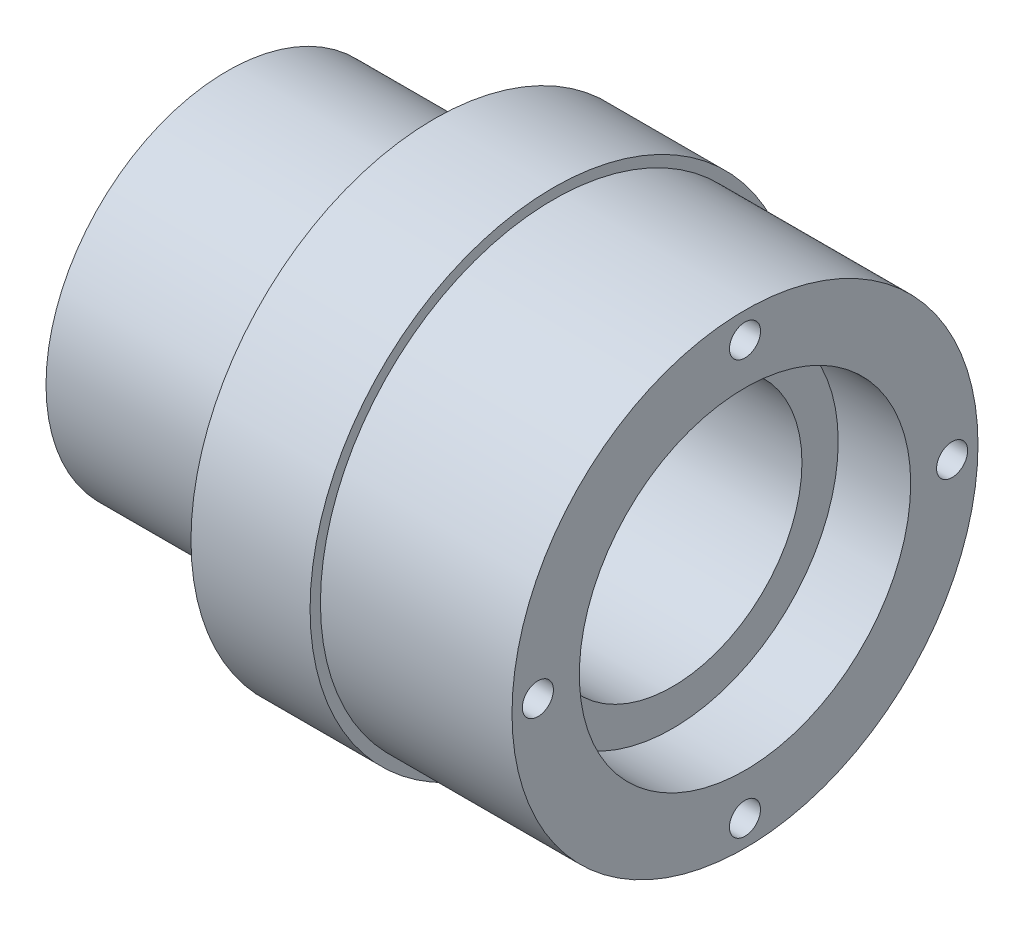
ISO-10303-21;
HEADER;
FILE_DESCRIPTION(('STEP AP214'),'2;1');
FILE_NAME('part.step','',(''),(''),'','','');
FILE_SCHEMA(('AUTOMOTIVE_DESIGN { 1 0 10303 214 1 1 1 1 }'));
ENDSEC;
DATA;
#1=APPLICATION_CONTEXT('core data for automotive mechanical design processes');
#2=APPLICATION_PROTOCOL_DEFINITION('international standard','automotive_design',2000,#1);
#3=PRODUCT_CONTEXT('',#1,'mechanical');
#4=PRODUCT('Part','Part','',(#3));
#5=PRODUCT_RELATED_PRODUCT_CATEGORY('part','',(#4));
#6=PRODUCT_DEFINITION_FORMATION('','',#4);
#7=PRODUCT_DEFINITION_CONTEXT('part definition',#1,'design');
#8=PRODUCT_DEFINITION('design','',#6,#7);
#9=PRODUCT_DEFINITION_SHAPE('','',#8);
#10=(LENGTH_UNIT() NAMED_UNIT(*) SI_UNIT(.MILLI.,.METRE.));
#11=(NAMED_UNIT(*) PLANE_ANGLE_UNIT() SI_UNIT($,.RADIAN.));
#12=(NAMED_UNIT(*) SI_UNIT($,.STERADIAN.) SOLID_ANGLE_UNIT());
#13=UNCERTAINTY_MEASURE_WITH_UNIT(LENGTH_MEASURE(1.E-05),#10,'distance_accuracy_value','');
#14=(GEOMETRIC_REPRESENTATION_CONTEXT(3) GLOBAL_UNCERTAINTY_ASSIGNED_CONTEXT((#13)) GLOBAL_UNIT_ASSIGNED_CONTEXT((#10,
#11,#12)) REPRESENTATION_CONTEXT('',''));
#15=CARTESIAN_POINT('',(0.,0.,0.));
#16=DIRECTION('',(0.,0.,1.));
#17=DIRECTION('',(1.,0.,0.));
#18=AXIS2_PLACEMENT_3D('',#15,#16,#17);
#19=CARTESIAN_POINT('',(15.,0.,0.));
#20=DIRECTION('',(-1.,0.,0.));
#21=DIRECTION('',(0.,0.,1.));
#22=AXIS2_PLACEMENT_3D('',#19,#20,#21);
#23=CYLINDRICAL_SURFACE('',#22,22.5);
#24=CARTESIAN_POINT('',(15.,0.,0.));
#25=DIRECTION('',(1.,0.,0.));
#26=DIRECTION('',(0.,0.,-1.));
#27=AXIS2_PLACEMENT_3D('',#24,#25,#26);
#28=CIRCLE('',#27,22.5);
#29=CARTESIAN_POINT('',(15.,0.,-22.5));
#30=VERTEX_POINT('',#29);
#31=EDGE_CURVE('E46',#30,#30,#28,.T.);
#32=ORIENTED_EDGE('',*,*,#31,.F.);
#33=EDGE_LOOP('',(#32));
#34=FACE_BOUND('',#33,.T.);
#35=CARTESIAN_POINT('',(-3.5,0.,0.));
#36=DIRECTION('',(-1.,0.,0.));
#37=DIRECTION('',(0.,0.,1.));
#38=AXIS2_PLACEMENT_3D('',#35,#36,#37);
#39=CIRCLE('',#38,22.5);
#40=CARTESIAN_POINT('',(-3.5,0.,22.5));
#41=VERTEX_POINT('',#40);
#42=EDGE_CURVE('E10',#41,#41,#39,.T.);
#43=ORIENTED_EDGE('',*,*,#42,.F.);
#44=EDGE_LOOP('',(#43));
#45=FACE_BOUND('',#44,.T.);
#46=ADVANCED_FACE('F36',(#34,#45),#23,.T.);
#47=CARTESIAN_POINT('',(15.,0.,0.));
#48=DIRECTION('',(-1.,0.,0.));
#49=DIRECTION('',(0.,0.,1.));
#50=AXIS2_PLACEMENT_3D('',#47,#48,#49);
#51=CYLINDRICAL_SURFACE('',#50,12.5);
#52=CARTESIAN_POINT('',(8.,0.,0.));
#53=DIRECTION('',(1.,0.,0.));
#54=DIRECTION('',(0.,0.,-1.));
#55=AXIS2_PLACEMENT_3D('',#52,#53,#54);
#56=CIRCLE('',#55,12.5);
#57=CARTESIAN_POINT('',(8.,0.,-12.5));
#58=VERTEX_POINT('',#57);
#59=EDGE_CURVE('E59',#58,#58,#56,.T.);
#60=ORIENTED_EDGE('',*,*,#59,.T.);
#61=EDGE_LOOP('',(#60));
#62=FACE_BOUND('',#61,.T.);
#63=CARTESIAN_POINT('',(-28.,0.,0.));
#64=DIRECTION('',(-1.,0.,0.));
#65=DIRECTION('',(0.,0.,1.));
#66=AXIS2_PLACEMENT_3D('',#63,#64,#65);
#67=CIRCLE('',#66,12.5);
#68=CARTESIAN_POINT('',(-28.,0.,12.5));
#69=VERTEX_POINT('',#68);
#70=EDGE_CURVE('E68',#69,#69,#67,.T.);
#71=ORIENTED_EDGE('',*,*,#70,.T.);
#72=EDGE_LOOP('',(#71));
#73=FACE_BOUND('',#72,.T.);
#74=ADVANCED_FACE('F140',(#62,#73),#51,.F.);
#75=CARTESIAN_POINT('',(-15.,0.,0.));
#76=DIRECTION('',(1.,0.,0.));
#77=DIRECTION('',(0.,0.,-1.));
#78=AXIS2_PLACEMENT_3D('',#75,#76,#77);
#79=PLANE('',#78);
#80=CARTESIAN_POINT('',(-15.,20.,0.));
#81=DIRECTION('',(-1.,0.,0.));
#82=DIRECTION('',(0.,0.,1.));
#83=AXIS2_PLACEMENT_3D('',#80,#81,#82);
#84=CIRCLE('',#83,1.5);
#85=CARTESIAN_POINT('',(-15.,20.,1.5));
#86=VERTEX_POINT('',#85);
#87=EDGE_CURVE('E117',#86,#86,#84,.T.);
#88=ORIENTED_EDGE('',*,*,#87,.F.);
#89=EDGE_LOOP('',(#88));
#90=FACE_BOUND('',#89,.T.);
#91=CARTESIAN_POINT('',(-15.,0.,19.9999999999998));
#92=DIRECTION('',(-1.,0.,0.));
#93=DIRECTION('',(0.,0.,1.));
#94=AXIS2_PLACEMENT_3D('',#91,#92,#93);
#95=CIRCLE('',#94,1.5);
#96=CARTESIAN_POINT('',(-15.,0.,21.4999999999998));
#97=VERTEX_POINT('',#96);
#98=EDGE_CURVE('E114',#97,#97,#95,.T.);
#99=ORIENTED_EDGE('',*,*,#98,.F.);
#100=EDGE_LOOP('',(#99));
#101=FACE_BOUND('',#100,.T.);
#102=CARTESIAN_POINT('',(-15.,-19.9999999999998,-1.97758476261356E-13));
#103=DIRECTION('',(-1.,0.,0.));
#104=DIRECTION('',(0.,0.,1.));
#105=AXIS2_PLACEMENT_3D('',#102,#103,#104);
#106=CIRCLE('',#105,1.5);
#107=CARTESIAN_POINT('',(-15.,-19.9999999999998,1.4999999999998));
#108=VERTEX_POINT('',#107);
#109=EDGE_CURVE('E108',#108,#108,#106,.T.);
#110=ORIENTED_EDGE('',*,*,#109,.F.);
#111=EDGE_LOOP('',(#110));
#112=FACE_BOUND('',#111,.T.);
#113=CARTESIAN_POINT('',(-15.,2.09488880330588E-13,-20.));
#114=DIRECTION('',(-1.,0.,0.));
#115=DIRECTION('',(0.,0.,1.));
#116=AXIS2_PLACEMENT_3D('',#113,#114,#115);
#117=CIRCLE('',#116,1.5);
#118=CARTESIAN_POINT('',(-15.,2.09488880330588E-13,-18.5));
#119=VERTEX_POINT('',#118);
#120=EDGE_CURVE('E101',#119,#119,#117,.T.);
#121=ORIENTED_EDGE('',*,*,#120,.F.);
#122=EDGE_LOOP('',(#121));
#123=FACE_BOUND('',#122,.T.);
#124=CARTESIAN_POINT('',(-15.,0.,0.));
#125=DIRECTION('',(1.,0.,0.));
#126=DIRECTION('',(0.,0.,-1.));
#127=AXIS2_PLACEMENT_3D('',#124,#125,#126);
#128=CIRCLE('',#127,17.5);
#129=CARTESIAN_POINT('',(-15.,0.,-17.5));
#130=VERTEX_POINT('',#129);
#131=EDGE_CURVE('E42',#130,#130,#128,.F.);
#132=ORIENTED_EDGE('',*,*,#131,.F.);
#133=EDGE_LOOP('',(#132));
#134=FACE_BOUND('',#133,.T.);
#135=CARTESIAN_POINT('',(-15.,0.,0.));
#136=DIRECTION('',(-1.,0.,0.));
#137=DIRECTION('',(0.,0.,1.));
#138=AXIS2_PLACEMENT_3D('',#135,#136,#137);
#139=CIRCLE('',#138,23.5);
#140=CARTESIAN_POINT('',(-15.,0.,23.5));
#141=VERTEX_POINT('',#140);
#142=EDGE_CURVE('E122',#141,#141,#139,.T.);
#143=ORIENTED_EDGE('',*,*,#142,.T.);
#144=EDGE_LOOP('',(#143));
#145=FACE_BOUND('',#144,.T.);
#146=ADVANCED_FACE('F147',(#90,#101,#112,#123,#134,#145),#79,.F.);
#147=CARTESIAN_POINT('',(15.,0.,0.));
#148=DIRECTION('',(1.,0.,0.));
#149=DIRECTION('',(0.,0.,-1.));
#150=AXIS2_PLACEMENT_3D('',#147,#148,#149);
#151=PLANE('',#150);
#152=CARTESIAN_POINT('',(15.,20.,0.));
#153=DIRECTION('',(1.,0.,0.));
#154=DIRECTION('',(0.,0.,-1.));
#155=AXIS2_PLACEMENT_3D('',#152,#153,#154);
#156=CIRCLE('',#155,1.5);
#157=CARTESIAN_POINT('',(15.,20.,-1.5));
#158=VERTEX_POINT('',#157);
#159=EDGE_CURVE('E93',#158,#158,#156,.T.);
#160=ORIENTED_EDGE('',*,*,#159,.F.);
#161=EDGE_LOOP('',(#160));
#162=FACE_BOUND('',#161,.T.);
#163=CARTESIAN_POINT('',(15.,0.,-20.0000000000003));
#164=DIRECTION('',(1.,0.,0.));
#165=DIRECTION('',(0.,0.,-1.));
#166=AXIS2_PLACEMENT_3D('',#163,#164,#165);
#167=CIRCLE('',#166,1.5);
#168=CARTESIAN_POINT('',(15.,0.,-21.5000000000003));
#169=VERTEX_POINT('',#168);
#170=EDGE_CURVE('E90',#169,#169,#167,.T.);
#171=ORIENTED_EDGE('',*,*,#170,.F.);
#172=EDGE_LOOP('',(#171));
#173=FACE_BOUND('',#172,.T.);
#174=CARTESIAN_POINT('',(15.,-20.,-5.30735490439912E-13));
#175=DIRECTION('',(1.,0.,0.));
#176=DIRECTION('',(0.,0.,-1.));
#177=AXIS2_PLACEMENT_3D('',#174,#175,#176);
#178=CIRCLE('',#177,1.5);
#179=CARTESIAN_POINT('',(15.,-20.,-1.50000000000053));
#180=VERTEX_POINT('',#179);
#181=EDGE_CURVE('E84',#180,#180,#178,.T.);
#182=ORIENTED_EDGE('',*,*,#181,.F.);
#183=EDGE_LOOP('',(#182));
#184=FACE_BOUND('',#183,.T.);
#185=CARTESIAN_POINT('',(15.,0.,19.9999999999997));
#186=DIRECTION('',(1.,0.,0.));
#187=DIRECTION('',(0.,0.,-1.));
#188=AXIS2_PLACEMENT_3D('',#185,#186,#187);
#189=CIRCLE('',#188,1.5);
#190=CARTESIAN_POINT('',(15.,0.,18.4999999999997));
#191=VERTEX_POINT('',#190);
#192=EDGE_CURVE('E77',#191,#191,#189,.T.);
#193=ORIENTED_EDGE('',*,*,#192,.F.);
#194=EDGE_LOOP('',(#193));
#195=FACE_BOUND('',#194,.T.);
#196=CARTESIAN_POINT('',(15.,0.,0.));
#197=DIRECTION('',(1.,0.,0.));
#198=DIRECTION('',(0.,0.,-1.));
#199=AXIS2_PLACEMENT_3D('',#196,#197,#198);
#200=CIRCLE('',#199,16.);
#201=CARTESIAN_POINT('',(15.,0.,-16.));
#202=VERTEX_POINT('',#201);
#203=EDGE_CURVE('E56',#202,#202,#200,.T.);
#204=ORIENTED_EDGE('',*,*,#203,.F.);
#205=EDGE_LOOP('',(#204));
#206=FACE_BOUND('',#205,.T.);
#207=ORIENTED_EDGE('',*,*,#31,.T.);
#208=EDGE_LOOP('',(#207));
#209=FACE_BOUND('',#208,.T.);
#210=ADVANCED_FACE('F153',(#162,#173,#184,#195,#206,#209),#151,.T.);
#211=CARTESIAN_POINT('',(-35.,0.,0.));
#212=DIRECTION('',(-1.,0.,0.));
#213=DIRECTION('',(0.,0.,1.));
#214=AXIS2_PLACEMENT_3D('',#211,#212,#213);
#215=PLANE('',#214);
#216=CARTESIAN_POINT('',(-35.,0.,0.));
#217=DIRECTION('',(-1.,0.,0.));
#218=DIRECTION('',(0.,0.,1.));
#219=AXIS2_PLACEMENT_3D('',#216,#217,#218);
#220=CIRCLE('',#219,16.);
#221=CARTESIAN_POINT('',(-35.,0.,16.));
#222=VERTEX_POINT('',#221);
#223=EDGE_CURVE('E65',#222,#222,#220,.T.);
#224=ORIENTED_EDGE('',*,*,#223,.F.);
#225=EDGE_LOOP('',(#224));
#226=FACE_BOUND('',#225,.T.);
#227=CARTESIAN_POINT('',(-35.,0.,0.));
#228=DIRECTION('',(-1.,0.,0.));
#229=DIRECTION('',(0.,0.,1.));
#230=AXIS2_PLACEMENT_3D('',#227,#228,#229);
#231=CIRCLE('',#230,17.5);
#232=CARTESIAN_POINT('',(-35.,0.,17.5));
#233=VERTEX_POINT('',#232);
#234=EDGE_CURVE('E50',#233,#233,#231,.T.);
#235=ORIENTED_EDGE('',*,*,#234,.T.);
#236=EDGE_LOOP('',(#235));
#237=FACE_BOUND('',#236,.T.);
#238=ADVANCED_FACE('F155',(#226,#237),#215,.T.);
#239=CARTESIAN_POINT('',(-35.,0.,0.));
#240=DIRECTION('',(1.,0.,0.));
#241=DIRECTION('',(0.,0.,-1.));
#242=AXIS2_PLACEMENT_3D('',#239,#240,#241);
#243=CYLINDRICAL_SURFACE('',#242,17.5);
#244=ORIENTED_EDGE('',*,*,#234,.F.);
#245=EDGE_LOOP('',(#244));
#246=FACE_BOUND('',#245,.T.);
#247=ORIENTED_EDGE('',*,*,#131,.T.);
#248=EDGE_LOOP('',(#247));
#249=FACE_BOUND('',#248,.T.);
#250=ADVANCED_FACE('F163',(#246,#249),#243,.T.);
#251=CARTESIAN_POINT('',(8.,0.,0.));
#252=DIRECTION('',(1.,0.,0.));
#253=DIRECTION('',(0.,0.,-1.));
#254=AXIS2_PLACEMENT_3D('',#251,#252,#253);
#255=CYLINDRICAL_SURFACE('',#254,16.);
#256=CARTESIAN_POINT('',(8.,0.,0.));
#257=DIRECTION('',(1.,0.,0.));
#258=DIRECTION('',(0.,0.,-1.));
#259=AXIS2_PLACEMENT_3D('',#256,#257,#258);
#260=CIRCLE('',#259,16.);
#261=CARTESIAN_POINT('',(8.,0.,-16.));
#262=VERTEX_POINT('',#261);
#263=EDGE_CURVE('E55',#262,#262,#260,.T.);
#264=ORIENTED_EDGE('',*,*,#263,.F.);
#265=EDGE_LOOP('',(#264));
#266=FACE_BOUND('',#265,.T.);
#267=ORIENTED_EDGE('',*,*,#203,.T.);
#268=EDGE_LOOP('',(#267));
#269=FACE_BOUND('',#268,.T.);
#270=ADVANCED_FACE('F171',(#266,#269),#255,.F.);
#271=CARTESIAN_POINT('',(8.,0.,0.));
#272=DIRECTION('',(1.,0.,0.));
#273=DIRECTION('',(0.,0.,-1.));
#274=AXIS2_PLACEMENT_3D('',#271,#272,#273);
#275=PLANE('',#274);
#276=ORIENTED_EDGE('',*,*,#59,.F.);
#277=EDGE_LOOP('',(#276));
#278=FACE_BOUND('',#277,.T.);
#279=ORIENTED_EDGE('',*,*,#263,.T.);
#280=EDGE_LOOP('',(#279));
#281=FACE_BOUND('',#280,.T.);
#282=ADVANCED_FACE('F176',(#278,#281),#275,.T.);
#283=CARTESIAN_POINT('',(-28.,0.,0.));
#284=DIRECTION('',(-1.,0.,0.));
#285=DIRECTION('',(0.,0.,1.));
#286=AXIS2_PLACEMENT_3D('',#283,#284,#285);
#287=CYLINDRICAL_SURFACE('',#286,16.);
#288=CARTESIAN_POINT('',(-28.,0.,0.));
#289=DIRECTION('',(-1.,0.,0.));
#290=DIRECTION('',(0.,0.,1.));
#291=AXIS2_PLACEMENT_3D('',#288,#289,#290);
#292=CIRCLE('',#291,16.);
#293=CARTESIAN_POINT('',(-28.,0.,16.));
#294=VERTEX_POINT('',#293);
#295=EDGE_CURVE('E64',#294,#294,#292,.T.);
#296=ORIENTED_EDGE('',*,*,#295,.F.);
#297=EDGE_LOOP('',(#296));
#298=FACE_BOUND('',#297,.T.);
#299=ORIENTED_EDGE('',*,*,#223,.T.);
#300=EDGE_LOOP('',(#299));
#301=FACE_BOUND('',#300,.T.);
#302=ADVANCED_FACE('F180',(#298,#301),#287,.F.);
#303=CARTESIAN_POINT('',(-28.,0.,0.));
#304=DIRECTION('',(-1.,0.,0.));
#305=DIRECTION('',(0.,0.,1.));
#306=AXIS2_PLACEMENT_3D('',#303,#304,#305);
#307=PLANE('',#306);
#308=ORIENTED_EDGE('',*,*,#70,.F.);
#309=EDGE_LOOP('',(#308));
#310=FACE_BOUND('',#309,.T.);
#311=ORIENTED_EDGE('',*,*,#295,.T.);
#312=EDGE_LOOP('',(#311));
#313=FACE_BOUND('',#312,.T.);
#314=ADVANCED_FACE('F184',(#310,#313),#307,.T.);
#315=CARTESIAN_POINT('',(10.,0.,19.9999999999997));
#316=DIRECTION('',(1.,0.,0.));
#317=DIRECTION('',(0.,0.,-1.));
#318=AXIS2_PLACEMENT_3D('',#315,#316,#317);
#319=CYLINDRICAL_SURFACE('',#318,1.5);
#320=CARTESIAN_POINT('',(10.,0.,19.9999999999997));
#321=DIRECTION('',(1.,0.,0.));
#322=DIRECTION('',(0.,0.,-1.));
#323=AXIS2_PLACEMENT_3D('',#320,#321,#322);
#324=CIRCLE('',#323,1.5);
#325=CARTESIAN_POINT('',(10.,0.,18.4999999999997));
#326=VERTEX_POINT('',#325);
#327=EDGE_CURVE('E74',#326,#326,#324,.T.);
#328=ORIENTED_EDGE('',*,*,#327,.F.);
#329=EDGE_LOOP('',(#328));
#330=FACE_BOUND('',#329,.T.);
#331=ORIENTED_EDGE('',*,*,#192,.T.);
#332=EDGE_LOOP('',(#331));
#333=FACE_BOUND('',#332,.T.);
#334=ADVANCED_FACE('F187',(#330,#333),#319,.F.);
#335=CARTESIAN_POINT('',(10.,0.,19.9999999999997));
#336=DIRECTION('',(1.,0.,0.));
#337=DIRECTION('',(0.,0.,-1.));
#338=AXIS2_PLACEMENT_3D('',#335,#336,#337);
#339=PLANE('',#338);
#340=ORIENTED_EDGE('',*,*,#327,.T.);
#341=EDGE_LOOP('',(#340));
#342=FACE_BOUND('',#341,.T.);
#343=ADVANCED_FACE('F189',(#342),#339,.T.);
#344=CARTESIAN_POINT('',(10.,-20.,-5.30735490439912E-13));
#345=DIRECTION('',(1.,0.,0.));
#346=DIRECTION('',(0.,0.,-1.));
#347=AXIS2_PLACEMENT_3D('',#344,#345,#346);
#348=CYLINDRICAL_SURFACE('',#347,1.5);
#349=CARTESIAN_POINT('',(10.,-20.,-5.30735490439912E-13));
#350=DIRECTION('',(1.,0.,0.));
#351=DIRECTION('',(0.,0.,-1.));
#352=AXIS2_PLACEMENT_3D('',#349,#350,#351);
#353=CIRCLE('',#352,1.5);
#354=CARTESIAN_POINT('',(10.,-20.,-1.50000000000053));
#355=VERTEX_POINT('',#354);
#356=EDGE_CURVE('E81',#355,#355,#353,.T.);
#357=ORIENTED_EDGE('',*,*,#356,.F.);
#358=EDGE_LOOP('',(#357));
#359=FACE_BOUND('',#358,.T.);
#360=ORIENTED_EDGE('',*,*,#181,.T.);
#361=EDGE_LOOP('',(#360));
#362=FACE_BOUND('',#361,.T.);
#363=ADVANCED_FACE('F192',(#359,#362),#348,.F.);
#364=CARTESIAN_POINT('',(10.,-20.,-5.30735490439912E-13));
#365=DIRECTION('',(1.,0.,0.));
#366=DIRECTION('',(0.,0.,-1.));
#367=AXIS2_PLACEMENT_3D('',#364,#365,#366);
#368=PLANE('',#367);
#369=ORIENTED_EDGE('',*,*,#356,.T.);
#370=EDGE_LOOP('',(#369));
#371=FACE_BOUND('',#370,.T.);
#372=ADVANCED_FACE('F196',(#371),#368,.T.);
#373=CARTESIAN_POINT('',(10.,0.,-20.0000000000003));
#374=DIRECTION('',(1.,0.,0.));
#375=DIRECTION('',(0.,0.,-1.));
#376=AXIS2_PLACEMENT_3D('',#373,#374,#375);
#377=CYLINDRICAL_SURFACE('',#376,1.5);
#378=CARTESIAN_POINT('',(10.,0.,-20.0000000000003));
#379=DIRECTION('',(1.,0.,0.));
#380=DIRECTION('',(0.,0.,-1.));
#381=AXIS2_PLACEMENT_3D('',#378,#379,#380);
#382=CIRCLE('',#381,1.5);
#383=CARTESIAN_POINT('',(10.,0.,-21.5000000000003));
#384=VERTEX_POINT('',#383);
#385=EDGE_CURVE('E87',#384,#384,#382,.T.);
#386=ORIENTED_EDGE('',*,*,#385,.F.);
#387=EDGE_LOOP('',(#386));
#388=FACE_BOUND('',#387,.T.);
#389=ORIENTED_EDGE('',*,*,#170,.T.);
#390=EDGE_LOOP('',(#389));
#391=FACE_BOUND('',#390,.T.);
#392=ADVANCED_FACE('F199',(#388,#391),#377,.F.);
#393=CARTESIAN_POINT('',(10.,0.,-20.0000000000003));
#394=DIRECTION('',(1.,0.,0.));
#395=DIRECTION('',(0.,0.,-1.));
#396=AXIS2_PLACEMENT_3D('',#393,#394,#395);
#397=PLANE('',#396);
#398=ORIENTED_EDGE('',*,*,#385,.T.);
#399=EDGE_LOOP('',(#398));
#400=FACE_BOUND('',#399,.T.);
#401=ADVANCED_FACE('F204',(#400),#397,.T.);
#402=CARTESIAN_POINT('',(10.,20.,0.));
#403=DIRECTION('',(1.,0.,0.));
#404=DIRECTION('',(0.,0.,-1.));
#405=AXIS2_PLACEMENT_3D('',#402,#403,#404);
#406=CYLINDRICAL_SURFACE('',#405,1.5);
#407=CARTESIAN_POINT('',(10.,20.,0.));
#408=DIRECTION('',(1.,0.,0.));
#409=DIRECTION('',(0.,0.,-1.));
#410=AXIS2_PLACEMENT_3D('',#407,#408,#409);
#411=CIRCLE('',#410,1.5);
#412=CARTESIAN_POINT('',(10.,20.,-1.5));
#413=VERTEX_POINT('',#412);
#414=EDGE_CURVE('E73',#413,#413,#411,.T.);
#415=ORIENTED_EDGE('',*,*,#414,.F.);
#416=EDGE_LOOP('',(#415));
#417=FACE_BOUND('',#416,.T.);
#418=ORIENTED_EDGE('',*,*,#159,.T.);
#419=EDGE_LOOP('',(#418));
#420=FACE_BOUND('',#419,.T.);
#421=ADVANCED_FACE('F207',(#417,#420),#406,.F.);
#422=CARTESIAN_POINT('',(10.,20.,0.));
#423=DIRECTION('',(1.,0.,0.));
#424=DIRECTION('',(0.,0.,-1.));
#425=AXIS2_PLACEMENT_3D('',#422,#423,#424);
#426=PLANE('',#425);
#427=ORIENTED_EDGE('',*,*,#414,.T.);
#428=EDGE_LOOP('',(#427));
#429=FACE_BOUND('',#428,.T.);
#430=ADVANCED_FACE('F214',(#429),#426,.T.);
#431=CARTESIAN_POINT('',(-10.,2.09488880330588E-13,-20.));
#432=DIRECTION('',(-1.,0.,0.));
#433=DIRECTION('',(0.,0.,1.));
#434=AXIS2_PLACEMENT_3D('',#431,#432,#433);
#435=CYLINDRICAL_SURFACE('',#434,1.5);
#436=CARTESIAN_POINT('',(-10.,2.09488880330588E-13,-20.));
#437=DIRECTION('',(-1.,0.,0.));
#438=DIRECTION('',(0.,0.,1.));
#439=AXIS2_PLACEMENT_3D('',#436,#437,#438);
#440=CIRCLE('',#439,1.5);
#441=CARTESIAN_POINT('',(-10.,2.09488880330588E-13,-18.5));
#442=VERTEX_POINT('',#441);
#443=EDGE_CURVE('E98',#442,#442,#440,.T.);
#444=ORIENTED_EDGE('',*,*,#443,.F.);
#445=EDGE_LOOP('',(#444));
#446=FACE_BOUND('',#445,.T.);
#447=ORIENTED_EDGE('',*,*,#120,.T.);
#448=EDGE_LOOP('',(#447));
#449=FACE_BOUND('',#448,.T.);
#450=ADVANCED_FACE('F218',(#446,#449),#435,.F.);
#451=CARTESIAN_POINT('',(-10.,2.09488880330588E-13,-20.));
#452=DIRECTION('',(-1.,0.,0.));
#453=DIRECTION('',(0.,0.,1.));
#454=AXIS2_PLACEMENT_3D('',#451,#452,#453);
#455=PLANE('',#454);
#456=ORIENTED_EDGE('',*,*,#443,.T.);
#457=EDGE_LOOP('',(#456));
#458=FACE_BOUND('',#457,.T.);
#459=ADVANCED_FACE('F220',(#458),#455,.T.);
#460=CARTESIAN_POINT('',(-10.,-19.9999999999998,-1.97758476261356E-13));
#461=DIRECTION('',(-1.,0.,0.));
#462=DIRECTION('',(0.,0.,1.));
#463=AXIS2_PLACEMENT_3D('',#460,#461,#462);
#464=CYLINDRICAL_SURFACE('',#463,1.5);
#465=CARTESIAN_POINT('',(-10.,-19.9999999999998,-1.97758476261356E-13));
#466=DIRECTION('',(-1.,0.,0.));
#467=DIRECTION('',(0.,0.,1.));
#468=AXIS2_PLACEMENT_3D('',#465,#466,#467);
#469=CIRCLE('',#468,1.5);
#470=CARTESIAN_POINT('',(-10.,-19.9999999999998,1.4999999999998));
#471=VERTEX_POINT('',#470);
#472=EDGE_CURVE('E105',#471,#471,#469,.T.);
#473=ORIENTED_EDGE('',*,*,#472,.F.);
#474=EDGE_LOOP('',(#473));
#475=FACE_BOUND('',#474,.T.);
#476=ORIENTED_EDGE('',*,*,#109,.T.);
#477=EDGE_LOOP('',(#476));
#478=FACE_BOUND('',#477,.T.);
#479=ADVANCED_FACE('F223',(#475,#478),#464,.F.);
#480=CARTESIAN_POINT('',(-10.,-19.9999999999998,-1.97758476261356E-13));
#481=DIRECTION('',(-1.,0.,0.));
#482=DIRECTION('',(0.,0.,1.));
#483=AXIS2_PLACEMENT_3D('',#480,#481,#482);
#484=PLANE('',#483);
#485=ORIENTED_EDGE('',*,*,#472,.T.);
#486=EDGE_LOOP('',(#485));
#487=FACE_BOUND('',#486,.T.);
#488=ADVANCED_FACE('F228',(#487),#484,.T.);
#489=CARTESIAN_POINT('',(-10.,0.,19.9999999999998));
#490=DIRECTION('',(-1.,0.,0.));
#491=DIRECTION('',(0.,0.,1.));
#492=AXIS2_PLACEMENT_3D('',#489,#490,#491);
#493=CYLINDRICAL_SURFACE('',#492,1.5);
#494=CARTESIAN_POINT('',(-10.,0.,19.9999999999998));
#495=DIRECTION('',(-1.,0.,0.));
#496=DIRECTION('',(0.,0.,1.));
#497=AXIS2_PLACEMENT_3D('',#494,#495,#496);
#498=CIRCLE('',#497,1.5);
#499=CARTESIAN_POINT('',(-10.,0.,21.4999999999998));
#500=VERTEX_POINT('',#499);
#501=EDGE_CURVE('E111',#500,#500,#498,.T.);
#502=ORIENTED_EDGE('',*,*,#501,.F.);
#503=EDGE_LOOP('',(#502));
#504=FACE_BOUND('',#503,.T.);
#505=ORIENTED_EDGE('',*,*,#98,.T.);
#506=EDGE_LOOP('',(#505));
#507=FACE_BOUND('',#506,.T.);
#508=ADVANCED_FACE('F231',(#504,#507),#493,.F.);
#509=CARTESIAN_POINT('',(-10.,0.,19.9999999999998));
#510=DIRECTION('',(-1.,0.,0.));
#511=DIRECTION('',(0.,0.,1.));
#512=AXIS2_PLACEMENT_3D('',#509,#510,#511);
#513=PLANE('',#512);
#514=ORIENTED_EDGE('',*,*,#501,.T.);
#515=EDGE_LOOP('',(#514));
#516=FACE_BOUND('',#515,.T.);
#517=ADVANCED_FACE('F236',(#516),#513,.T.);
#518=CARTESIAN_POINT('',(-10.,20.,0.));
#519=DIRECTION('',(-1.,0.,0.));
#520=DIRECTION('',(0.,0.,1.));
#521=AXIS2_PLACEMENT_3D('',#518,#519,#520);
#522=CYLINDRICAL_SURFACE('',#521,1.5);
#523=CARTESIAN_POINT('',(-10.,20.,0.));
#524=DIRECTION('',(-1.,0.,0.));
#525=DIRECTION('',(0.,0.,1.));
#526=AXIS2_PLACEMENT_3D('',#523,#524,#525);
#527=CIRCLE('',#526,1.5);
#528=CARTESIAN_POINT('',(-10.,20.,1.5));
#529=VERTEX_POINT('',#528);
#530=EDGE_CURVE('E78',#529,#529,#527,.T.);
#531=ORIENTED_EDGE('',*,*,#530,.F.);
#532=EDGE_LOOP('',(#531));
#533=FACE_BOUND('',#532,.T.);
#534=ORIENTED_EDGE('',*,*,#87,.T.);
#535=EDGE_LOOP('',(#534));
#536=FACE_BOUND('',#535,.T.);
#537=ADVANCED_FACE('F239',(#533,#536),#522,.F.);
#538=CARTESIAN_POINT('',(-10.,20.,0.));
#539=DIRECTION('',(-1.,0.,0.));
#540=DIRECTION('',(0.,0.,1.));
#541=AXIS2_PLACEMENT_3D('',#538,#539,#540);
#542=PLANE('',#541);
#543=ORIENTED_EDGE('',*,*,#530,.T.);
#544=EDGE_LOOP('',(#543));
#545=FACE_BOUND('',#544,.T.);
#546=ADVANCED_FACE('F137',(#545),#542,.T.);
#547=CARTESIAN_POINT('',(-3.5,0.,0.));
#548=DIRECTION('',(-1.,0.,0.));
#549=DIRECTION('',(0.,0.,1.));
#550=AXIS2_PLACEMENT_3D('',#547,#548,#549);
#551=CYLINDRICAL_SURFACE('',#550,23.5);
#552=CARTESIAN_POINT('',(-3.5,0.,0.));
#553=DIRECTION('',(-1.,0.,0.));
#554=DIRECTION('',(0.,0.,1.));
#555=AXIS2_PLACEMENT_3D('',#552,#553,#554);
#556=CIRCLE('',#555,23.5);
#557=CARTESIAN_POINT('',(-3.5,0.,23.5));
#558=VERTEX_POINT('',#557);
#559=EDGE_CURVE('E102',#558,#558,#556,.T.);
#560=ORIENTED_EDGE('',*,*,#559,.T.);
#561=EDGE_LOOP('',(#560));
#562=FACE_BOUND('',#561,.T.);
#563=ORIENTED_EDGE('',*,*,#142,.F.);
#564=EDGE_LOOP('',(#563));
#565=FACE_BOUND('',#564,.T.);
#566=ADVANCED_FACE('F128',(#562,#565),#551,.T.);
#567=CARTESIAN_POINT('',(-3.5,0.,0.));
#568=DIRECTION('',(-1.,0.,0.));
#569=DIRECTION('',(0.,0.,1.));
#570=AXIS2_PLACEMENT_3D('',#567,#568,#569);
#571=PLANE('',#570);
#572=ORIENTED_EDGE('',*,*,#42,.T.);
#573=EDGE_LOOP('',(#572));
#574=FACE_BOUND('',#573,.T.);
#575=ORIENTED_EDGE('',*,*,#559,.F.);
#576=EDGE_LOOP('',(#575));
#577=FACE_BOUND('',#576,.T.);
#578=ADVANCED_FACE('F131',(#574,#577),#571,.F.);
#579=CLOSED_SHELL('',(#46,#74,#146,#210,#238,#250,#270,#282,#302,#314,#334,#343,#363,#372,#392,
#401,#421,#430,#450,#459,#479,#488,#508,#517,#537,#546,#566,#578));
#580=MANIFOLD_SOLID_BREP('B2',#579);
#581=ADVANCED_BREP_SHAPE_REPRESENTATION('',(#18,#580),#14);
#582=SHAPE_DEFINITION_REPRESENTATION(#9,#581);
ENDSEC;
END-ISO-10303-21;
